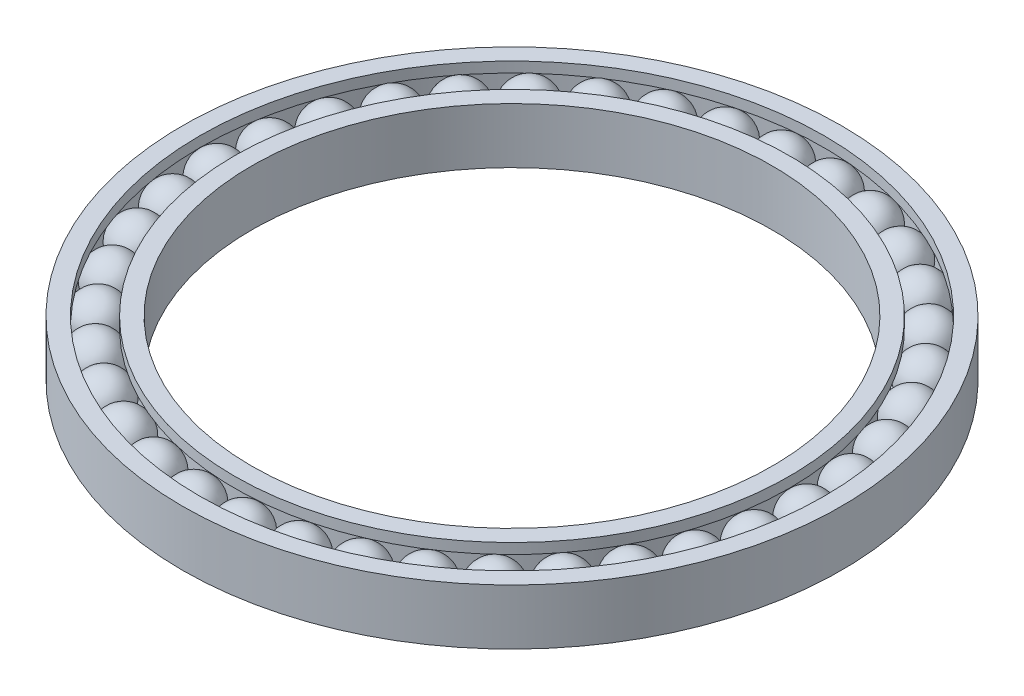
ISO-10303-21;
HEADER;
FILE_DESCRIPTION(('STEP AP214'),'2;1');
FILE_NAME('part.step','',(''),(''),'','','');
FILE_SCHEMA(('AUTOMOTIVE_DESIGN { 1 0 10303 214 1 1 1 1 }'));
ENDSEC;
DATA;
#1=APPLICATION_CONTEXT('core data for automotive mechanical design processes');
#2=APPLICATION_PROTOCOL_DEFINITION('international standard','automotive_design',2000,#1);
#3=PRODUCT_CONTEXT('',#1,'mechanical');
#4=PRODUCT('Part','Part','',(#3));
#5=PRODUCT_RELATED_PRODUCT_CATEGORY('part','',(#4));
#6=PRODUCT_DEFINITION_FORMATION('','',#4);
#7=PRODUCT_DEFINITION_CONTEXT('part definition',#1,'design');
#8=PRODUCT_DEFINITION('design','',#6,#7);
#9=PRODUCT_DEFINITION_SHAPE('','',#8);
#10=(LENGTH_UNIT() NAMED_UNIT(*) SI_UNIT(.MILLI.,.METRE.));
#11=(NAMED_UNIT(*) PLANE_ANGLE_UNIT() SI_UNIT($,.RADIAN.));
#12=(NAMED_UNIT(*) SI_UNIT($,.STERADIAN.) SOLID_ANGLE_UNIT());
#13=UNCERTAINTY_MEASURE_WITH_UNIT(LENGTH_MEASURE(1.E-05),#10,'distance_accuracy_value','');
#14=(GEOMETRIC_REPRESENTATION_CONTEXT(3) GLOBAL_UNCERTAINTY_ASSIGNED_CONTEXT((#13)) GLOBAL_UNIT_ASSIGNED_CONTEXT((#10,
#11,#12)) REPRESENTATION_CONTEXT('',''));
#15=CARTESIAN_POINT('',(0.,0.,0.));
#16=DIRECTION('',(0.,0.,1.));
#17=DIRECTION('',(1.,0.,0.));
#18=AXIS2_PLACEMENT_3D('',#15,#16,#17);
#19=CARTESIAN_POINT('',(41.9220658360983,7.02116840817153,-6.9955555091324));
#20=DIRECTION('',(0.,1.,0.));
#21=DIRECTION('',(0.986361303402725,0.,-0.16459459028072));
#22=AXIS2_PLACEMENT_3D('',#19,#20,#21);
#23=SPHERICAL_SURFACE('',#22,3.5);
#24=CARTESIAN_POINT('',(41.9220658360983,10.5211684081715,-6.9955555091324));
#25=VERTEX_POINT('',#24);
#26=VERTEX_LOOP('',#25);
#27=FACE_BOUND('',#26,.T.);
#28=ADVANCED_FACE('F58',(#27),#23,.T.);
#29=CLOSED_SHELL('',(#28));
#30=MANIFOLD_SOLID_BREP('B2',#29);
#31=CARTESIAN_POINT('',(40.1988729066168,7.02116840817153,-13.8002905000285));
#32=DIRECTION('',(0.,1.,0.));
#33=DIRECTION('',(0.945817241700639,0.,-0.32469946920467));
#34=AXIS2_PLACEMENT_3D('',#31,#32,#33);
#35=SPHERICAL_SURFACE('',#34,3.5);
#36=CARTESIAN_POINT('',(40.1988729066168,10.5211684081715,-13.8002905000285));
#37=VERTEX_POINT('',#36);
#38=VERTEX_LOOP('',#37);
#39=FACE_BOUND('',#38,.T.);
#40=ADVANCED_FACE('F84',(#39),#35,.T.);
#41=CLOSED_SHELL('',(#40));
#42=MANIFOLD_SOLID_BREP('B6',#41);
#43=CARTESIAN_POINT('',(37.3791595148837,7.02116840817153,-20.2285895407562));
#44=DIRECTION('',(0.,1.,0.));
#45=DIRECTION('',(0.879473751206496,0.,-0.475947393037062));
#46=AXIS2_PLACEMENT_3D('',#43,#44,#45);
#47=SPHERICAL_SURFACE('',#46,3.5);
#48=CARTESIAN_POINT('',(37.3791595148837,10.5211684081715,-20.2285895407562));
#49=VERTEX_POINT('',#48);
#50=VERTEX_LOOP('',#49);
#51=FACE_BOUND('',#50,.T.);
#52=ADVANCED_FACE('F110',(#51),#47,.T.);
#53=CLOSED_SHELL('',(#52));
#54=MANIFOLD_SOLID_BREP('B54',#53);
#55=CARTESIAN_POINT('',(33.539840091781,7.02116840817153,-26.1051053908095));
#56=DIRECTION('',(0.,1.,0.));
#57=DIRECTION('',(0.789140509396402,0.,-0.614212712689658));
#58=AXIS2_PLACEMENT_3D('',#55,#56,#57);
#59=SPHERICAL_SURFACE('',#58,3.5);
#60=CARTESIAN_POINT('',(33.539840091781,10.5211684081715,-26.1051053908095));
#61=VERTEX_POINT('',#60);
#62=VERTEX_LOOP('',#61);
#63=FACE_BOUND('',#62,.T.);
#64=ADVANCED_FACE('F136',(#63),#59,.T.);
#65=CLOSED_SHELL('',(#64));
#66=MANIFOLD_SOLID_BREP('B80',#65);
#67=CARTESIAN_POINT('',(28.7856412628123,7.02116840817153,-31.2695420167323));
#68=DIRECTION('',(0.,1.,0.));
#69=DIRECTION('',(0.67728157162575,0.,-0.735723910673123));
#70=AXIS2_PLACEMENT_3D('',#67,#68,#69);
#71=SPHERICAL_SURFACE('',#70,3.5);
#72=CARTESIAN_POINT('',(28.7856412628123,10.5211684081715,-31.2695420167323));
#73=VERTEX_POINT('',#72);
#74=VERTEX_LOOP('',#73);
#75=FACE_BOUND('',#74,.T.);
#76=ADVANCED_FACE('F162',(#75),#71,.T.);
#77=CLOSED_SHELL('',(#76));
#78=MANIFOLD_SOLID_BREP('B106',#77);
#79=CARTESIAN_POINT('',(23.2462451787605,7.02116840817153,-35.5810270500511));
#80=DIRECTION('',(0.,1.,0.));
#81=DIRECTION('',(0.546948158122437,0.,-0.837166478262522));
#82=AXIS2_PLACEMENT_3D('',#79,#80,#81);
#83=SPHERICAL_SURFACE('',#82,3.5);
#84=CARTESIAN_POINT('',(23.2462451787605,10.5211684081715,-35.5810270500511));
#85=VERTEX_POINT('',#84);
#86=VERTEX_LOOP('',#85);
#87=FACE_BOUND('',#86,.T.);
#88=ADVANCED_FACE('F188',(#87),#83,.T.);
#89=CLOSED_SHELL('',(#88));
#90=MANIFOLD_SOLID_BREP('B132',#89);
#91=CARTESIAN_POINT('',(17.0727521246705,7.02116840817153,-38.9219544182594));
#92=DIRECTION('',(0.,1.,0.));
#93=DIRECTION('',(0.40169542465298,0.,-0.915773326655053));
#94=AXIS2_PLACEMENT_3D('',#91,#92,#93);
#95=SPHERICAL_SURFACE('',#94,3.5);
#96=CARTESIAN_POINT('',(17.0727521246705,10.5211684081715,-38.9219544182594));
#97=VERTEX_POINT('',#96);
#98=VERTEX_LOOP('',#97);
#99=FACE_BOUND('',#98,.T.);
#100=ADVANCED_FACE('F214',(#99),#95,.T.);
#101=CLOSED_SHELL('',(#100));
#102=MANIFOLD_SOLID_BREP('B158',#101);
#103=CARTESIAN_POINT('',(10.4335588979628,7.02116840817153,-41.2011923319004));
#104=DIRECTION('',(0.,1.,0.));
#105=DIRECTION('',(0.24548548714081,0.,-0.969400265939328));
#106=AXIS2_PLACEMENT_3D('',#103,#104,#105);
#107=SPHERICAL_SURFACE('',#106,3.5);
#108=CARTESIAN_POINT('',(10.4335588979628,10.5211684081715,-41.2011923319004));
#109=VERTEX_POINT('',#108);
#110=VERTEX_LOOP('',#109);
#111=FACE_BOUND('',#110,.T.);
#112=ADVANCED_FACE('F240',(#111),#107,.T.);
#113=CLOSED_SHELL('',(#112));
#114=MANIFOLD_SOLID_BREP('B184',#113);
#115=CARTESIAN_POINT('',(3.50976538277678,7.02116840817153,-42.3565691222196));
#116=DIRECTION('',(0.,1.,0.));
#117=DIRECTION('',(0.082579345472343,0.,-0.996584493006669));
#118=AXIS2_PLACEMENT_3D('',#115,#116,#117);
#119=SPHERICAL_SURFACE('',#118,3.5);
#120=CARTESIAN_POINT('',(3.50976538277678,10.5211684081715,-42.3565691222196));
#121=VERTEX_POINT('',#120);
#122=VERTEX_LOOP('',#121);
#123=FACE_BOUND('',#122,.T.);
#124=ADVANCED_FACE('F266',(#123),#119,.T.);
#125=CLOSED_SHELL('',(#124));
#126=MANIFOLD_SOLID_BREP('B210',#125);
#127=CARTESIAN_POINT('',(-3.50976538277589,7.02116840817153,-42.3565691222197));
#128=DIRECTION('',(0.,1.,0.));
#129=DIRECTION('',(-0.0825793454723221,0.,-0.996584493006671));
#130=AXIS2_PLACEMENT_3D('',#127,#128,#129);
#131=SPHERICAL_SURFACE('',#130,3.5);
#132=CARTESIAN_POINT('',(-3.50976538277589,10.5211684081715,-42.3565691222197));
#133=VERTEX_POINT('',#132);
#134=VERTEX_LOOP('',#133);
#135=FACE_BOUND('',#134,.T.);
#136=ADVANCED_FACE('F292',(#135),#131,.T.);
#137=CLOSED_SHELL('',(#136));
#138=MANIFOLD_SOLID_BREP('B236',#137);
#139=CARTESIAN_POINT('',(-10.4335588979619,7.02116840817153,-41.2011923319006));
#140=DIRECTION('',(0.,1.,0.));
#141=DIRECTION('',(-0.24548548714079,0.,-0.969400265939333));
#142=AXIS2_PLACEMENT_3D('',#139,#140,#141);
#143=SPHERICAL_SURFACE('',#142,3.5);
#144=CARTESIAN_POINT('',(-10.4335588979619,10.5211684081715,-41.2011923319006));
#145=VERTEX_POINT('',#144);
#146=VERTEX_LOOP('',#145);
#147=FACE_BOUND('',#146,.T.);
#148=ADVANCED_FACE('F318',(#147),#143,.T.);
#149=CLOSED_SHELL('',(#148));
#150=MANIFOLD_SOLID_BREP('B262',#149);
#151=CARTESIAN_POINT('',(-17.0727521246697,7.02116840817153,-38.9219544182598));
#152=DIRECTION('',(0.,1.,0.));
#153=DIRECTION('',(-0.40169542465296,0.,-0.915773326655062));
#154=AXIS2_PLACEMENT_3D('',#151,#152,#153);
#155=SPHERICAL_SURFACE('',#154,3.5);
#156=CARTESIAN_POINT('',(-17.0727521246697,10.5211684081715,-38.9219544182598));
#157=VERTEX_POINT('',#156);
#158=VERTEX_LOOP('',#157);
#159=FACE_BOUND('',#158,.T.);
#160=ADVANCED_FACE('F344',(#159),#155,.T.);
#161=CLOSED_SHELL('',(#160));
#162=MANIFOLD_SOLID_BREP('B288',#161);
#163=CARTESIAN_POINT('',(-23.2462451787597,7.02116840817153,-35.5810270500516));
#164=DIRECTION('',(0.,1.,0.));
#165=DIRECTION('',(-0.546948158122419,0.,-0.837166478262534));
#166=AXIS2_PLACEMENT_3D('',#163,#164,#165);
#167=SPHERICAL_SURFACE('',#166,3.5);
#168=CARTESIAN_POINT('',(-23.2462451787597,10.5211684081715,-35.5810270500516));
#169=VERTEX_POINT('',#168);
#170=VERTEX_LOOP('',#169);
#171=FACE_BOUND('',#170,.T.);
#172=ADVANCED_FACE('F370',(#171),#167,.T.);
#173=CLOSED_SHELL('',(#172));
#174=MANIFOLD_SOLID_BREP('B314',#173);
#175=CARTESIAN_POINT('',(-28.7856412628116,7.02116840817153,-31.2695420167329));
#176=DIRECTION('',(0.,1.,0.));
#177=DIRECTION('',(-0.677281571625734,0.,-0.735723910673138));
#178=AXIS2_PLACEMENT_3D('',#175,#176,#177);
#179=SPHERICAL_SURFACE('',#178,3.5);
#180=CARTESIAN_POINT('',(-28.7856412628116,10.5211684081715,-31.2695420167329));
#181=VERTEX_POINT('',#180);
#182=VERTEX_LOOP('',#181);
#183=FACE_BOUND('',#182,.T.);
#184=ADVANCED_FACE('F396',(#183),#179,.T.);
#185=CLOSED_SHELL('',(#184));
#186=MANIFOLD_SOLID_BREP('B340',#185);
#187=CARTESIAN_POINT('',(-33.5398400917804,7.02116840817153,-26.1051053908102));
#188=DIRECTION('',(0.,1.,0.));
#189=DIRECTION('',(-0.789140509396388,0.,-0.614212712689675));
#190=AXIS2_PLACEMENT_3D('',#187,#188,#189);
#191=SPHERICAL_SURFACE('',#190,3.5);
#192=CARTESIAN_POINT('',(-33.5398400917804,10.5211684081715,-26.1051053908102));
#193=VERTEX_POINT('',#192);
#194=VERTEX_LOOP('',#193);
#195=FACE_BOUND('',#194,.T.);
#196=ADVANCED_FACE('F422',(#195),#191,.T.);
#197=CLOSED_SHELL('',(#196));
#198=MANIFOLD_SOLID_BREP('B366',#197);
#199=CARTESIAN_POINT('',(-37.3791595148832,7.02116840817153,-20.228589540757));
#200=DIRECTION('',(0.,1.,0.));
#201=DIRECTION('',(-0.879473751206485,0.,-0.475947393037081));
#202=AXIS2_PLACEMENT_3D('',#199,#200,#201);
#203=SPHERICAL_SURFACE('',#202,3.5);
#204=CARTESIAN_POINT('',(-37.3791595148832,10.5211684081715,-20.228589540757));
#205=VERTEX_POINT('',#204);
#206=VERTEX_LOOP('',#205);
#207=FACE_BOUND('',#206,.T.);
#208=ADVANCED_FACE('F448',(#207),#203,.T.);
#209=CLOSED_SHELL('',(#208));
#210=MANIFOLD_SOLID_BREP('B392',#209);
#211=CARTESIAN_POINT('',(-40.1988729066165,7.02116840817153,-13.8002905000294));
#212=DIRECTION('',(0.,1.,0.));
#213=DIRECTION('',(-0.945817241700632,0.,-0.324699469204691));
#214=AXIS2_PLACEMENT_3D('',#211,#212,#213);
#215=SPHERICAL_SURFACE('',#214,3.5);
#216=CARTESIAN_POINT('',(-40.1988729066165,10.5211684081715,-13.8002905000294));
#217=VERTEX_POINT('',#216);
#218=VERTEX_LOOP('',#217);
#219=FACE_BOUND('',#218,.T.);
#220=ADVANCED_FACE('F474',(#219),#215,.T.);
#221=CLOSED_SHELL('',(#220));
#222=MANIFOLD_SOLID_BREP('B418',#221);
#223=CARTESIAN_POINT('',(-41.9220658360981,7.02116840817153,-6.99555550913332));
#224=DIRECTION('',(0.,1.,0.));
#225=DIRECTION('',(-0.986361303402721,0.,-0.164594590280741));
#226=AXIS2_PLACEMENT_3D('',#223,#224,#225);
#227=SPHERICAL_SURFACE('',#226,3.5);
#228=CARTESIAN_POINT('',(-41.9220658360981,10.5211684081715,-6.99555550913332));
#229=VERTEX_POINT('',#228);
#230=VERTEX_LOOP('',#229);
#231=FACE_BOUND('',#230,.T.);
#232=ADVANCED_FACE('F500',(#231),#227,.T.);
#233=CLOSED_SHELL('',(#232));
#234=MANIFOLD_SOLID_BREP('B444',#233);
#235=CARTESIAN_POINT('',(-42.5017340922404,7.02116840817153,0.));
#236=DIRECTION('',(0.,1.,0.));
#237=DIRECTION('',(-1.,0.,0.));
#238=AXIS2_PLACEMENT_3D('',#235,#236,#237);
#239=SPHERICAL_SURFACE('',#238,3.5);
#240=CARTESIAN_POINT('',(-42.5017340922404,10.5211684081715,0.));
#241=VERTEX_POINT('',#240);
#242=VERTEX_LOOP('',#241);
#243=FACE_BOUND('',#242,.T.);
#244=ADVANCED_FACE('F526',(#243),#239,.T.);
#245=CLOSED_SHELL('',(#244));
#246=MANIFOLD_SOLID_BREP('B470',#245);
#247=CARTESIAN_POINT('',(-41.9220658360982,7.02116840817153,6.99555550913271));
#248=DIRECTION('',(0.,1.,0.));
#249=DIRECTION('',(-0.986361303402724,0.,0.164594590280727));
#250=AXIS2_PLACEMENT_3D('',#247,#248,#249);
#251=SPHERICAL_SURFACE('',#250,3.5);
#252=CARTESIAN_POINT('',(-41.9220658360982,10.5211684081715,6.99555550913271));
#253=VERTEX_POINT('',#252);
#254=VERTEX_LOOP('',#253);
#255=FACE_BOUND('',#254,.T.);
#256=ADVANCED_FACE('F552',(#255),#251,.T.);
#257=CLOSED_SHELL('',(#256));
#258=MANIFOLD_SOLID_BREP('B496',#257);
#259=CARTESIAN_POINT('',(-40.1988729066167,7.02116840817153,13.8002905000288));
#260=DIRECTION('',(0.,1.,0.));
#261=DIRECTION('',(-0.945817241700637,0.,0.324699469204677));
#262=AXIS2_PLACEMENT_3D('',#259,#260,#261);
#263=SPHERICAL_SURFACE('',#262,3.5);
#264=CARTESIAN_POINT('',(-40.1988729066167,10.5211684081715,13.8002905000288));
#265=VERTEX_POINT('',#264);
#266=VERTEX_LOOP('',#265);
#267=FACE_BOUND('',#266,.T.);
#268=ADVANCED_FACE('F578',(#267),#263,.T.);
#269=CLOSED_SHELL('',(#268));
#270=MANIFOLD_SOLID_BREP('B522',#269);
#271=CARTESIAN_POINT('',(-37.3791595148835,7.02116840817153,20.2285895407565));
#272=DIRECTION('',(0.,1.,0.));
#273=DIRECTION('',(-0.879473751206492,0.,0.475947393037068));
#274=AXIS2_PLACEMENT_3D('',#271,#272,#273);
#275=SPHERICAL_SURFACE('',#274,3.5);
#276=CARTESIAN_POINT('',(-37.3791595148835,10.5211684081715,20.2285895407565));
#277=VERTEX_POINT('',#276);
#278=VERTEX_LOOP('',#277);
#279=FACE_BOUND('',#278,.T.);
#280=ADVANCED_FACE('F604',(#279),#275,.T.);
#281=CLOSED_SHELL('',(#280));
#282=MANIFOLD_SOLID_BREP('B548',#281);
#283=CARTESIAN_POINT('',(-33.5398400917808,7.02116840817153,26.1051053908097));
#284=DIRECTION('',(0.,1.,0.));
#285=DIRECTION('',(-0.789140509396397,0.,0.614212712689663));
#286=AXIS2_PLACEMENT_3D('',#283,#284,#285);
#287=SPHERICAL_SURFACE('',#286,3.5);
#288=CARTESIAN_POINT('',(-33.5398400917808,10.5211684081715,26.1051053908097));
#289=VERTEX_POINT('',#288);
#290=VERTEX_LOOP('',#289);
#291=FACE_BOUND('',#290,.T.);
#292=ADVANCED_FACE('F630',(#291),#287,.T.);
#293=CLOSED_SHELL('',(#292));
#294=MANIFOLD_SOLID_BREP('B574',#293);
#295=CARTESIAN_POINT('',(-28.7856412628121,7.02116840817153,31.2695420167325));
#296=DIRECTION('',(0.,1.,0.));
#297=DIRECTION('',(-0.677281571625745,0.,0.735723910673128));
#298=AXIS2_PLACEMENT_3D('',#295,#296,#297);
#299=SPHERICAL_SURFACE('',#298,3.5);
#300=CARTESIAN_POINT('',(-28.7856412628121,10.5211684081715,31.2695420167325));
#301=VERTEX_POINT('',#300);
#302=VERTEX_LOOP('',#301);
#303=FACE_BOUND('',#302,.T.);
#304=ADVANCED_FACE('F656',(#303),#299,.T.);
#305=CLOSED_SHELL('',(#304));
#306=MANIFOLD_SOLID_BREP('B600',#305);
#307=CARTESIAN_POINT('',(-23.2462451787602,7.02116840817153,35.5810270500512));
#308=DIRECTION('',(0.,1.,0.));
#309=DIRECTION('',(-0.546948158122431,0.,0.837166478262526));
#310=AXIS2_PLACEMENT_3D('',#307,#308,#309);
#311=SPHERICAL_SURFACE('',#310,3.5);
#312=CARTESIAN_POINT('',(-23.2462451787602,10.5211684081715,35.5810270500512));
#313=VERTEX_POINT('',#312);
#314=VERTEX_LOOP('',#313);
#315=FACE_BOUND('',#314,.T.);
#316=ADVANCED_FACE('F682',(#315),#311,.T.);
#317=CLOSED_SHELL('',(#316));
#318=MANIFOLD_SOLID_BREP('B626',#317);
#319=CARTESIAN_POINT('',(-17.0727521246703,7.02116840817153,38.9219544182596));
#320=DIRECTION('',(0.,1.,0.));
#321=DIRECTION('',(-0.401695424652974,0.,0.915773326655056));
#322=AXIS2_PLACEMENT_3D('',#319,#320,#321);
#323=SPHERICAL_SURFACE('',#322,3.5);
#324=CARTESIAN_POINT('',(-17.0727521246703,10.5211684081715,38.9219544182596));
#325=VERTEX_POINT('',#324);
#326=VERTEX_LOOP('',#325);
#327=FACE_BOUND('',#326,.T.);
#328=ADVANCED_FACE('F708',(#327),#323,.T.);
#329=CLOSED_SHELL('',(#328));
#330=MANIFOLD_SOLID_BREP('B652',#329);
#331=CARTESIAN_POINT('',(-10.4335588979625,7.02116840817153,41.2011923319005));
#332=DIRECTION('',(0.,1.,0.));
#333=DIRECTION('',(-0.245485487140803,0.,0.96940026593933));
#334=AXIS2_PLACEMENT_3D('',#331,#332,#333);
#335=SPHERICAL_SURFACE('',#334,3.5);
#336=CARTESIAN_POINT('',(-10.4335588979625,10.5211684081715,41.2011923319005));
#337=VERTEX_POINT('',#336);
#338=VERTEX_LOOP('',#337);
#339=FACE_BOUND('',#338,.T.);
#340=ADVANCED_FACE('F734',(#339),#335,.T.);
#341=CLOSED_SHELL('',(#340));
#342=MANIFOLD_SOLID_BREP('B678',#341);
#343=CARTESIAN_POINT('',(-3.50976538277648,7.02116840817153,42.3565691222197));
#344=DIRECTION('',(0.,1.,0.));
#345=DIRECTION('',(-0.082579345472336,0.,0.99658449300667));
#346=AXIS2_PLACEMENT_3D('',#343,#344,#345);
#347=SPHERICAL_SURFACE('',#346,3.5);
#348=CARTESIAN_POINT('',(-3.50976538277648,10.5211684081715,42.3565691222197));
#349=VERTEX_POINT('',#348);
#350=VERTEX_LOOP('',#349);
#351=FACE_BOUND('',#350,.T.);
#352=ADVANCED_FACE('F760',(#351),#347,.T.);
#353=CLOSED_SHELL('',(#352));
#354=MANIFOLD_SOLID_BREP('B704',#353);
#355=CARTESIAN_POINT('',(3.50976538277618,7.02116840817153,42.3565691222197));
#356=DIRECTION('',(0.,1.,0.));
#357=DIRECTION('',(0.0825793454723289,0.,0.99658449300667));
#358=AXIS2_PLACEMENT_3D('',#355,#356,#357);
#359=SPHERICAL_SURFACE('',#358,3.5);
#360=CARTESIAN_POINT('',(3.50976538277618,10.5211684081715,42.3565691222197));
#361=VERTEX_POINT('',#360);
#362=VERTEX_LOOP('',#361);
#363=FACE_BOUND('',#362,.T.);
#364=ADVANCED_FACE('F786',(#363),#359,.T.);
#365=CLOSED_SHELL('',(#364));
#366=MANIFOLD_SOLID_BREP('B730',#365);
#367=CARTESIAN_POINT('',(10.4335588979622,7.02116840817153,41.2011923319006));
#368=DIRECTION('',(0.,1.,0.));
#369=DIRECTION('',(0.245485487140796,0.,0.969400265939331));
#370=AXIS2_PLACEMENT_3D('',#367,#368,#369);
#371=SPHERICAL_SURFACE('',#370,3.5);
#372=CARTESIAN_POINT('',(10.4335588979622,10.5211684081715,41.2011923319006));
#373=VERTEX_POINT('',#372);
#374=VERTEX_LOOP('',#373);
#375=FACE_BOUND('',#374,.T.);
#376=ADVANCED_FACE('F812',(#375),#371,.T.);
#377=CLOSED_SHELL('',(#376));
#378=MANIFOLD_SOLID_BREP('B756',#377);
#379=CARTESIAN_POINT('',(17.07275212467,7.02116840817153,38.9219544182597));
#380=DIRECTION('',(0.,1.,0.));
#381=DIRECTION('',(0.401695424652967,0.,0.915773326655059));
#382=AXIS2_PLACEMENT_3D('',#379,#380,#381);
#383=SPHERICAL_SURFACE('',#382,3.5);
#384=CARTESIAN_POINT('',(17.07275212467,10.5211684081715,38.9219544182597));
#385=VERTEX_POINT('',#384);
#386=VERTEX_LOOP('',#385);
#387=FACE_BOUND('',#386,.T.);
#388=ADVANCED_FACE('F838',(#387),#383,.T.);
#389=CLOSED_SHELL('',(#388));
#390=MANIFOLD_SOLID_BREP('B782',#389);
#391=CARTESIAN_POINT('',(23.24624517876,7.02116840817153,35.5810270500514));
#392=DIRECTION('',(0.,1.,0.));
#393=DIRECTION('',(0.546948158122425,0.,0.83716647826253));
#394=AXIS2_PLACEMENT_3D('',#391,#392,#393);
#395=SPHERICAL_SURFACE('',#394,3.5);
#396=CARTESIAN_POINT('',(23.24624517876,10.5211684081715,35.5810270500514));
#397=VERTEX_POINT('',#396);
#398=VERTEX_LOOP('',#397);
#399=FACE_BOUND('',#398,.T.);
#400=ADVANCED_FACE('F864',(#399),#395,.T.);
#401=CLOSED_SHELL('',(#400));
#402=MANIFOLD_SOLID_BREP('B808',#401);
#403=CARTESIAN_POINT('',(28.7856412628119,7.02116840817153,31.2695420167327));
#404=DIRECTION('',(0.,1.,0.));
#405=DIRECTION('',(0.67728157162574,0.,0.735723910673133));
#406=AXIS2_PLACEMENT_3D('',#403,#404,#405);
#407=SPHERICAL_SURFACE('',#406,3.5);
#408=CARTESIAN_POINT('',(28.7856412628119,10.5211684081715,31.2695420167327));
#409=VERTEX_POINT('',#408);
#410=VERTEX_LOOP('',#409);
#411=FACE_BOUND('',#410,.T.);
#412=ADVANCED_FACE('F890',(#411),#407,.T.);
#413=CLOSED_SHELL('',(#412));
#414=MANIFOLD_SOLID_BREP('B834',#413);
#415=CARTESIAN_POINT('',(33.5398400917806,7.02116840817153,26.10510539081));
#416=DIRECTION('',(0.,1.,0.));
#417=DIRECTION('',(0.789140509396393,0.,0.614212712689669));
#418=AXIS2_PLACEMENT_3D('',#415,#416,#417);
#419=SPHERICAL_SURFACE('',#418,3.5);
#420=CARTESIAN_POINT('',(33.5398400917806,10.5211684081715,26.10510539081));
#421=VERTEX_POINT('',#420);
#422=VERTEX_LOOP('',#421);
#423=FACE_BOUND('',#422,.T.);
#424=ADVANCED_FACE('F916',(#423),#419,.T.);
#425=CLOSED_SHELL('',(#424));
#426=MANIFOLD_SOLID_BREP('B860',#425);
#427=CARTESIAN_POINT('',(37.3791595148834,7.02116840817153,20.2285895407568));
#428=DIRECTION('',(0.,1.,0.));
#429=DIRECTION('',(0.879473751206489,0.,0.475947393037075));
#430=AXIS2_PLACEMENT_3D('',#427,#428,#429);
#431=SPHERICAL_SURFACE('',#430,3.5);
#432=CARTESIAN_POINT('',(37.3791595148834,10.5211684081715,20.2285895407568));
#433=VERTEX_POINT('',#432);
#434=VERTEX_LOOP('',#433);
#435=FACE_BOUND('',#434,.T.);
#436=ADVANCED_FACE('F942',(#435),#431,.T.);
#437=CLOSED_SHELL('',(#436));
#438=MANIFOLD_SOLID_BREP('B886',#437);
#439=CARTESIAN_POINT('',(40.1988729066166,7.02116840817153,13.8002905000291));
#440=DIRECTION('',(0.,1.,0.));
#441=DIRECTION('',(0.945817241700635,0.,0.324699469204684));
#442=AXIS2_PLACEMENT_3D('',#439,#440,#441);
#443=SPHERICAL_SURFACE('',#442,3.5);
#444=CARTESIAN_POINT('',(40.1988729066166,10.5211684081715,13.8002905000291));
#445=VERTEX_POINT('',#444);
#446=VERTEX_LOOP('',#445);
#447=FACE_BOUND('',#446,.T.);
#448=ADVANCED_FACE('F968',(#447),#443,.T.);
#449=CLOSED_SHELL('',(#448));
#450=MANIFOLD_SOLID_BREP('B912',#449);
#451=CARTESIAN_POINT('',(41.9220658360981,7.02116840817153,6.99555550913302));
#452=DIRECTION('',(0.,1.,0.));
#453=DIRECTION('',(0.986361303402722,0.,0.164594590280734));
#454=AXIS2_PLACEMENT_3D('',#451,#452,#453);
#455=SPHERICAL_SURFACE('',#454,3.5);
#456=CARTESIAN_POINT('',(41.9220658360981,10.5211684081715,6.99555550913302));
#457=VERTEX_POINT('',#456);
#458=VERTEX_LOOP('',#457);
#459=FACE_BOUND('',#458,.T.);
#460=ADVANCED_FACE('F994',(#459),#455,.T.);
#461=CLOSED_SHELL('',(#460));
#462=MANIFOLD_SOLID_BREP('B938',#461);
#463=CARTESIAN_POINT('',(42.5017340922404,7.02116840817153,0.));
#464=DIRECTION('',(0.,1.,0.));
#465=DIRECTION('',(1.,0.,0.));
#466=AXIS2_PLACEMENT_3D('',#463,#464,#465);
#467=SPHERICAL_SURFACE('',#466,3.5);
#468=CARTESIAN_POINT('',(42.5017340922404,10.5211684081715,0.));
#469=VERTEX_POINT('',#468);
#470=VERTEX_LOOP('',#469);
#471=FACE_BOUND('',#470,.T.);
#472=ADVANCED_FACE('F1022',(#471),#467,.T.);
#473=CLOSED_SHELL('',(#472));
#474=MANIFOLD_SOLID_BREP('B964',#473);
#475=CARTESIAN_POINT('',(0.,11.,0.));
#476=DIRECTION('',(0.,-1.,0.));
#477=DIRECTION('',(0.,0.,-1.));
#478=AXIS2_PLACEMENT_3D('',#475,#476,#477);
#479=CYLINDRICAL_SURFACE('',#478,40.);
#480=CARTESIAN_POINT('',(0.,3.,0.));
#481=DIRECTION('',(0.,1.,0.));
#482=DIRECTION('',(0.,0.,1.));
#483=AXIS2_PLACEMENT_3D('',#480,#481,#482);
#484=CIRCLE('',#483,40.);
#485=CARTESIAN_POINT('',(0.,3.,40.));
#486=VERTEX_POINT('',#485);
#487=EDGE_CURVE('E1057',#486,#486,#484,.T.);
#488=ORIENTED_EDGE('',*,*,#487,.T.);
#489=EDGE_LOOP('',(#488));
#490=FACE_BOUND('',#489,.T.);
#491=CARTESIAN_POINT('',(0.,4.5,0.));
#492=DIRECTION('',(0.,1.,0.));
#493=DIRECTION('',(-1.,0.,0.));
#494=AXIS2_PLACEMENT_3D('',#491,#492,#493);
#495=CIRCLE('',#494,40.);
#496=CARTESIAN_POINT('',(-40.,4.5,0.));
#497=VERTEX_POINT('',#496);
#498=EDGE_CURVE('E1053',#497,#497,#495,.T.);
#499=ORIENTED_EDGE('',*,*,#498,.F.);
#500=EDGE_LOOP('',(#499));
#501=FACE_BOUND('',#500,.T.);
#502=ADVANCED_FACE('F1049',(#490,#501),#479,.T.);
#503=CARTESIAN_POINT('',(0.,11.,0.));
#504=DIRECTION('',(0.,1.,0.));
#505=DIRECTION('',(0.,0.,1.));
#506=AXIS2_PLACEMENT_3D('',#503,#504,#505);
#507=PLANE('',#506);
#508=CARTESIAN_POINT('',(0.,11.,0.));
#509=DIRECTION('',(0.,1.,0.));
#510=DIRECTION('',(0.,0.,1.));
#511=AXIS2_PLACEMENT_3D('',#508,#509,#510);
#512=CIRCLE('',#511,40.);
#513=CARTESIAN_POINT('',(0.,11.,40.));
#514=VERTEX_POINT('',#513);
#515=EDGE_CURVE('E1021',#514,#514,#512,.T.);
#516=ORIENTED_EDGE('',*,*,#515,.T.);
#517=EDGE_LOOP('',(#516));
#518=FACE_BOUND('',#517,.T.);
#519=CARTESIAN_POINT('',(0.,11.,0.));
#520=DIRECTION('',(0.,1.,0.));
#521=DIRECTION('',(0.,0.,1.));
#522=AXIS2_PLACEMENT_3D('',#519,#520,#521);
#523=CIRCLE('',#522,37.5);
#524=CARTESIAN_POINT('',(0.,11.,37.5));
#525=VERTEX_POINT('',#524);
#526=EDGE_CURVE('E1062',#525,#525,#523,.T.);
#527=ORIENTED_EDGE('',*,*,#526,.F.);
#528=EDGE_LOOP('',(#527));
#529=FACE_BOUND('',#528,.T.);
#530=ADVANCED_FACE('F1102',(#518,#529),#507,.T.);
#531=CARTESIAN_POINT('',(0.,3.,0.));
#532=DIRECTION('',(0.,1.,0.));
#533=DIRECTION('',(0.,0.,1.));
#534=AXIS2_PLACEMENT_3D('',#531,#532,#533);
#535=PLANE('',#534);
#536=ORIENTED_EDGE('',*,*,#487,.F.);
#537=EDGE_LOOP('',(#536));
#538=FACE_BOUND('',#537,.T.);
#539=CARTESIAN_POINT('',(0.,3.,0.));
#540=DIRECTION('',(0.,1.,0.));
#541=DIRECTION('',(0.,0.,1.));
#542=AXIS2_PLACEMENT_3D('',#539,#540,#541);
#543=CIRCLE('',#542,37.5);
#544=CARTESIAN_POINT('',(0.,3.,37.5));
#545=VERTEX_POINT('',#544);
#546=EDGE_CURVE('E1065',#545,#545,#543,.T.);
#547=ORIENTED_EDGE('',*,*,#546,.T.);
#548=EDGE_LOOP('',(#547));
#549=FACE_BOUND('',#548,.T.);
#550=ADVANCED_FACE('F1086',(#538,#549),#535,.F.);
#551=CARTESIAN_POINT('',(0.,9.5,0.));
#552=DIRECTION('',(0.,1.,0.));
#553=DIRECTION('',(-1.,0.,0.));
#554=AXIS2_PLACEMENT_3D('',#551,#552,#553);
#555=CIRCLE('',#554,40.);
#556=CARTESIAN_POINT('',(-40.,9.49999999999999,0.));
#557=VERTEX_POINT('',#556);
#558=EDGE_CURVE('E1067',#557,#557,#555,.T.);
#559=ORIENTED_EDGE('',*,*,#558,.T.);
#560=EDGE_LOOP('',(#559));
#561=FACE_BOUND('',#560,.T.);
#562=ORIENTED_EDGE('',*,*,#515,.F.);
#563=EDGE_LOOP('',(#562));
#564=FACE_BOUND('',#563,.T.);
#565=ADVANCED_FACE('F1051',(#561,#564),#479,.T.);
#566=CARTESIAN_POINT('',(0.,11.,0.));
#567=DIRECTION('',(0.,-1.,0.));
#568=DIRECTION('',(0.,0.,-1.));
#569=AXIS2_PLACEMENT_3D('',#566,#567,#568);
#570=CYLINDRICAL_SURFACE('',#569,37.5);
#571=ORIENTED_EDGE('',*,*,#526,.T.);
#572=EDGE_LOOP('',(#571));
#573=FACE_BOUND('',#572,.T.);
#574=ORIENTED_EDGE('',*,*,#546,.F.);
#575=EDGE_LOOP('',(#574));
#576=FACE_BOUND('',#575,.T.);
#577=ADVANCED_FACE('F1088',(#573,#576),#570,.F.);
#578=CARTESIAN_POINT('',(0.,4.5,0.));
#579=DIRECTION('',(0.,1.,0.));
#580=DIRECTION('',(-1.,0.,0.));
#581=AXIS2_PLACEMENT_3D('',#578,#579,#580);
#582=PLANE('',#581);
#583=CARTESIAN_POINT('',(0.,4.5,0.));
#584=DIRECTION('',(0.,1.,0.));
#585=DIRECTION('',(-1.,0.,0.));
#586=AXIS2_PLACEMENT_3D('',#583,#584,#585);
#587=CIRCLE('',#586,38.75);
#588=CARTESIAN_POINT('',(-38.75,4.5,0.));
#589=VERTEX_POINT('',#588);
#590=EDGE_CURVE('E1069',#589,#589,#587,.T.);
#591=ORIENTED_EDGE('',*,*,#590,.F.);
#592=EDGE_LOOP('',(#591));
#593=FACE_BOUND('',#592,.T.);
#594=ORIENTED_EDGE('',*,*,#498,.T.);
#595=EDGE_LOOP('',(#594));
#596=FACE_BOUND('',#595,.T.);
#597=ADVANCED_FACE('F1090',(#593,#596),#582,.T.);
#598=CARTESIAN_POINT('',(0.,9.5,0.));
#599=DIRECTION('',(0.,1.,0.));
#600=DIRECTION('',(-1.,0.,0.));
#601=AXIS2_PLACEMENT_3D('',#598,#599,#600);
#602=PLANE('',#601);
#603=CARTESIAN_POINT('',(0.,9.5,0.));
#604=DIRECTION('',(0.,1.,0.));
#605=DIRECTION('',(-1.,0.,0.));
#606=AXIS2_PLACEMENT_3D('',#603,#604,#605);
#607=CIRCLE('',#606,38.75);
#608=CARTESIAN_POINT('',(-38.75,9.5,0.));
#609=VERTEX_POINT('',#608);
#610=EDGE_CURVE('E1074',#609,#609,#607,.T.);
#611=ORIENTED_EDGE('',*,*,#610,.T.);
#612=EDGE_LOOP('',(#611));
#613=FACE_BOUND('',#612,.T.);
#614=ORIENTED_EDGE('',*,*,#558,.F.);
#615=EDGE_LOOP('',(#614));
#616=FACE_BOUND('',#615,.T.);
#617=ADVANCED_FACE('F1097',(#613,#616),#602,.F.);
#618=CARTESIAN_POINT('',(0.,10.5,0.));
#619=DIRECTION('',(0.,1.,0.));
#620=DIRECTION('',(-1.,0.,0.));
#621=AXIS2_PLACEMENT_3D('',#618,#619,#620);
#622=CYLINDRICAL_SURFACE('',#621,38.75);
#623=ORIENTED_EDGE('',*,*,#590,.T.);
#624=EDGE_LOOP('',(#623));
#625=FACE_BOUND('',#624,.T.);
#626=ORIENTED_EDGE('',*,*,#610,.F.);
#627=EDGE_LOOP('',(#626));
#628=FACE_BOUND('',#627,.T.);
#629=ADVANCED_FACE('F1147',(#625,#628),#622,.T.);
#630=CLOSED_SHELL('',(#502,#530,#550,#565,#577,#597,#617,#629));
#631=MANIFOLD_SOLID_BREP('B990',#630);
#632=CARTESIAN_POINT('',(0.,11.,0.));
#633=DIRECTION('',(0.,-1.,0.));
#634=DIRECTION('',(0.,0.,-1.));
#635=AXIS2_PLACEMENT_3D('',#632,#633,#634);
#636=CYLINDRICAL_SURFACE('',#635,45.);
#637=CARTESIAN_POINT('',(0.,3.,0.));
#638=DIRECTION('',(0.,1.,0.));
#639=DIRECTION('',(0.,0.,1.));
#640=AXIS2_PLACEMENT_3D('',#637,#638,#639);
#641=CIRCLE('',#640,45.);
#642=CARTESIAN_POINT('',(0.,3.,45.));
#643=VERTEX_POINT('',#642);
#644=EDGE_CURVE('E1188',#643,#643,#641,.T.);
#645=ORIENTED_EDGE('',*,*,#644,.F.);
#646=EDGE_LOOP('',(#645));
#647=FACE_BOUND('',#646,.T.);
#648=CARTESIAN_POINT('',(0.,4.5,0.));
#649=DIRECTION('',(0.,1.,0.));
#650=DIRECTION('',(-1.,0.,0.));
#651=AXIS2_PLACEMENT_3D('',#648,#649,#650);
#652=CIRCLE('',#651,45.);
#653=CARTESIAN_POINT('',(-45.,4.5,0.));
#654=VERTEX_POINT('',#653);
#655=EDGE_CURVE('E1174',#654,#654,#652,.T.);
#656=ORIENTED_EDGE('',*,*,#655,.T.);
#657=EDGE_LOOP('',(#656));
#658=FACE_BOUND('',#657,.T.);
#659=ADVANCED_FACE('F1170',(#647,#658),#636,.F.);
#660=CARTESIAN_POINT('',(0.,11.,0.));
#661=DIRECTION('',(0.,1.,0.));
#662=DIRECTION('',(0.,0.,1.));
#663=AXIS2_PLACEMENT_3D('',#660,#661,#662);
#664=PLANE('',#663);
#665=CARTESIAN_POINT('',(0.,11.,0.));
#666=DIRECTION('',(0.,1.,0.));
#667=DIRECTION('',(0.,0.,1.));
#668=AXIS2_PLACEMENT_3D('',#665,#666,#667);
#669=CIRCLE('',#668,47.5);
#670=CARTESIAN_POINT('',(0.,11.,47.5));
#671=VERTEX_POINT('',#670);
#672=EDGE_CURVE('E1048',#671,#671,#669,.T.);
#673=ORIENTED_EDGE('',*,*,#672,.T.);
#674=EDGE_LOOP('',(#673));
#675=FACE_BOUND('',#674,.T.);
#676=CARTESIAN_POINT('',(0.,11.,0.));
#677=DIRECTION('',(0.,1.,0.));
#678=DIRECTION('',(0.,0.,1.));
#679=AXIS2_PLACEMENT_3D('',#676,#677,#678);
#680=CIRCLE('',#679,45.);
#681=CARTESIAN_POINT('',(0.,11.,45.));
#682=VERTEX_POINT('',#681);
#683=EDGE_CURVE('E1185',#682,#682,#680,.T.);
#684=ORIENTED_EDGE('',*,*,#683,.F.);
#685=EDGE_LOOP('',(#684));
#686=FACE_BOUND('',#685,.T.);
#687=ADVANCED_FACE('F1219',(#675,#686),#664,.T.);
#688=CARTESIAN_POINT('',(0.,3.,0.));
#689=DIRECTION('',(0.,1.,0.));
#690=DIRECTION('',(0.,0.,1.));
#691=AXIS2_PLACEMENT_3D('',#688,#689,#690);
#692=PLANE('',#691);
#693=CARTESIAN_POINT('',(0.,3.,0.));
#694=DIRECTION('',(0.,1.,0.));
#695=DIRECTION('',(0.,0.,1.));
#696=AXIS2_PLACEMENT_3D('',#693,#694,#695);
#697=CIRCLE('',#696,47.5);
#698=CARTESIAN_POINT('',(0.,3.,47.5));
#699=VERTEX_POINT('',#698);
#700=EDGE_CURVE('E1179',#699,#699,#697,.T.);
#701=ORIENTED_EDGE('',*,*,#700,.F.);
#702=EDGE_LOOP('',(#701));
#703=FACE_BOUND('',#702,.T.);
#704=ORIENTED_EDGE('',*,*,#644,.T.);
#705=EDGE_LOOP('',(#704));
#706=FACE_BOUND('',#705,.T.);
#707=ADVANCED_FACE('F1215',(#703,#706),#692,.F.);
#708=CARTESIAN_POINT('',(0.,11.,0.));
#709=DIRECTION('',(0.,-1.,0.));
#710=DIRECTION('',(0.,0.,-1.));
#711=AXIS2_PLACEMENT_3D('',#708,#709,#710);
#712=CYLINDRICAL_SURFACE('',#711,47.5);
#713=ORIENTED_EDGE('',*,*,#672,.F.);
#714=EDGE_LOOP('',(#713));
#715=FACE_BOUND('',#714,.T.);
#716=ORIENTED_EDGE('',*,*,#700,.T.);
#717=EDGE_LOOP('',(#716));
#718=FACE_BOUND('',#717,.T.);
#719=ADVANCED_FACE('F1172',(#715,#718),#712,.T.);
#720=CARTESIAN_POINT('',(0.,9.5,0.));
#721=DIRECTION('',(0.,1.,0.));
#722=DIRECTION('',(-1.,0.,0.));
#723=AXIS2_PLACEMENT_3D('',#720,#721,#722);
#724=CIRCLE('',#723,45.);
#725=CARTESIAN_POINT('',(-45.,9.49999999999999,0.));
#726=VERTEX_POINT('',#725);
#727=EDGE_CURVE('E1190',#726,#726,#724,.T.);
#728=ORIENTED_EDGE('',*,*,#727,.F.);
#729=EDGE_LOOP('',(#728));
#730=FACE_BOUND('',#729,.T.);
#731=ORIENTED_EDGE('',*,*,#683,.T.);
#732=EDGE_LOOP('',(#731));
#733=FACE_BOUND('',#732,.T.);
#734=ADVANCED_FACE('F1221',(#730,#733),#636,.F.);
#735=CARTESIAN_POINT('',(0.,10.5,0.));
#736=DIRECTION('',(0.,1.,0.));
#737=DIRECTION('',(-1.,0.,0.));
#738=AXIS2_PLACEMENT_3D('',#735,#736,#737);
#739=CYLINDRICAL_SURFACE('',#738,46.25);
#740=CARTESIAN_POINT('',(0.,9.5,0.));
#741=DIRECTION('',(0.,1.,0.));
#742=DIRECTION('',(-1.,0.,0.));
#743=AXIS2_PLACEMENT_3D('',#740,#741,#742);
#744=CIRCLE('',#743,46.25);
#745=CARTESIAN_POINT('',(-46.25,9.49999999999999,0.));
#746=VERTEX_POINT('',#745);
#747=EDGE_CURVE('E1200',#746,#746,#744,.T.);
#748=ORIENTED_EDGE('',*,*,#747,.T.);
#749=EDGE_LOOP('',(#748));
#750=FACE_BOUND('',#749,.T.);
#751=CARTESIAN_POINT('',(0.,4.5,0.));
#752=DIRECTION('',(0.,1.,0.));
#753=DIRECTION('',(-1.,0.,0.));
#754=AXIS2_PLACEMENT_3D('',#751,#752,#753);
#755=CIRCLE('',#754,46.25);
#756=CARTESIAN_POINT('',(-46.25,4.5,0.));
#757=VERTEX_POINT('',#756);
#758=EDGE_CURVE('E1193',#757,#757,#755,.T.);
#759=ORIENTED_EDGE('',*,*,#758,.F.);
#760=EDGE_LOOP('',(#759));
#761=FACE_BOUND('',#760,.T.);
#762=ADVANCED_FACE('F1227',(#750,#761),#739,.F.);
#763=CARTESIAN_POINT('',(0.,4.5,0.));
#764=DIRECTION('',(0.,1.,0.));
#765=DIRECTION('',(-1.,0.,0.));
#766=AXIS2_PLACEMENT_3D('',#763,#764,#765);
#767=PLANE('',#766);
#768=ORIENTED_EDGE('',*,*,#655,.F.);
#769=EDGE_LOOP('',(#768));
#770=FACE_BOUND('',#769,.T.);
#771=ORIENTED_EDGE('',*,*,#758,.T.);
#772=EDGE_LOOP('',(#771));
#773=FACE_BOUND('',#772,.T.);
#774=ADVANCED_FACE('F1224',(#770,#773),#767,.T.);
#775=CARTESIAN_POINT('',(0.,9.5,0.));
#776=DIRECTION('',(0.,1.,0.));
#777=DIRECTION('',(-1.,0.,0.));
#778=AXIS2_PLACEMENT_3D('',#775,#776,#777);
#779=PLANE('',#778);
#780=ORIENTED_EDGE('',*,*,#727,.T.);
#781=EDGE_LOOP('',(#780));
#782=FACE_BOUND('',#781,.T.);
#783=ORIENTED_EDGE('',*,*,#747,.F.);
#784=EDGE_LOOP('',(#783));
#785=FACE_BOUND('',#784,.T.);
#786=ADVANCED_FACE('F1226',(#782,#785),#779,.F.);
#787=CLOSED_SHELL('',(#659,#687,#707,#719,#734,#762,#774,#786));
#788=MANIFOLD_SOLID_BREP('B1016',#787);
#789=ADVANCED_BREP_SHAPE_REPRESENTATION('',(#18,#30,#42,#54,#66,#78,#90,#102,#114,#126,#138,
#150,#162,#174,#186,#198,#210,#222,#234,#246,#258,#270,#282,#294,#306,#318,#330,#342,#354,#366,
#378,#390,#402,#414,#426,#438,#450,#462,#474,#631,#788),#14);
#790=SHAPE_DEFINITION_REPRESENTATION(#9,#789);
ENDSEC;
END-ISO-10303-21;
